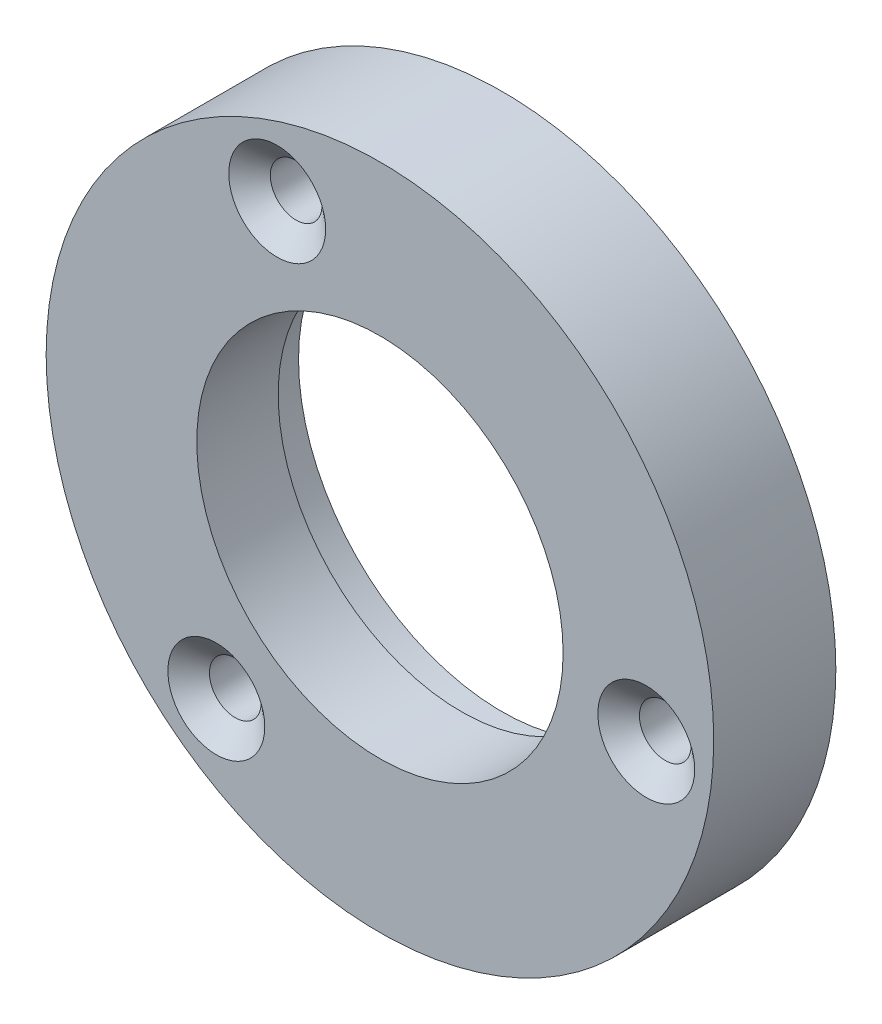
ISO-10303-21;
HEADER;
FILE_DESCRIPTION(('STEP AP214'),'2;1');
FILE_NAME('part.step','',(''),(''),'','','');
FILE_SCHEMA(('AUTOMOTIVE_DESIGN { 1 0 10303 214 1 1 1 1 }'));
ENDSEC;
DATA;
#1=APPLICATION_CONTEXT('core data for automotive mechanical design processes');
#2=APPLICATION_PROTOCOL_DEFINITION('international standard','automotive_design',2000,#1);
#3=PRODUCT_CONTEXT('',#1,'mechanical');
#4=PRODUCT('Part','Part','',(#3));
#5=PRODUCT_RELATED_PRODUCT_CATEGORY('part','',(#4));
#6=PRODUCT_DEFINITION_FORMATION('','',#4);
#7=PRODUCT_DEFINITION_CONTEXT('part definition',#1,'design');
#8=PRODUCT_DEFINITION('design','',#6,#7);
#9=PRODUCT_DEFINITION_SHAPE('','',#8);
#10=(LENGTH_UNIT() NAMED_UNIT(*) SI_UNIT(.MILLI.,.METRE.));
#11=(NAMED_UNIT(*) PLANE_ANGLE_UNIT() SI_UNIT($,.RADIAN.));
#12=(NAMED_UNIT(*) SI_UNIT($,.STERADIAN.) SOLID_ANGLE_UNIT());
#13=UNCERTAINTY_MEASURE_WITH_UNIT(LENGTH_MEASURE(1.E-05),#10,'distance_accuracy_value','');
#14=(GEOMETRIC_REPRESENTATION_CONTEXT(3) GLOBAL_UNCERTAINTY_ASSIGNED_CONTEXT((#13)) GLOBAL_UNIT_ASSIGNED_CONTEXT((#10,
#11,#12)) REPRESENTATION_CONTEXT('',''));
#15=CARTESIAN_POINT('',(0.,0.,0.));
#16=DIRECTION('',(0.,0.,1.));
#17=DIRECTION('',(1.,0.,0.));
#18=AXIS2_PLACEMENT_3D('',#15,#16,#17);
#19=CARTESIAN_POINT('',(0.,0.,0.));
#20=DIRECTION('',(0.,0.,1.));
#21=DIRECTION('',(1.,0.,0.));
#22=AXIS2_PLACEMENT_3D('',#19,#20,#21);
#23=CYLINDRICAL_SURFACE('',#22,5.715);
#24=CARTESIAN_POINT('',(0.,0.,3.81));
#25=DIRECTION('',(0.,0.,1.));
#26=DIRECTION('',(1.,0.,0.));
#27=AXIS2_PLACEMENT_3D('',#24,#25,#26);
#28=CIRCLE('',#27,5.715);
#29=CARTESIAN_POINT('',(5.715,0.,3.81));
#30=VERTEX_POINT('',#29);
#31=EDGE_CURVE('E51',#30,#30,#28,.T.);
#32=CARTESIAN_POINT('',(0.,0.,1.27));
#33=DIRECTION('',(0.,0.,-1.));
#34=DIRECTION('',(-1.,0.,0.));
#35=AXIS2_PLACEMENT_3D('',#32,#33,#34);
#36=CIRCLE('',#35,5.715);
#37=CARTESIAN_POINT('',(5.715,0.,1.27));
#38=VERTEX_POINT('',#37);
#39=EDGE_CURVE('E42',#38,#38,#36,.F.);
#40=CARTESIAN_POINT('',(5.715,0.,3.81));
#41=CARTESIAN_POINT('',(5.715,0.,3.78354166666667));
#42=CARTESIAN_POINT('',(5.715,0.,3.75708333333333));
#43=CARTESIAN_POINT('',(5.715,0.,3.70416666666667));
#44=CARTESIAN_POINT('',(5.715,0.,3.67770833333333));
#45=CARTESIAN_POINT('',(5.715,0.,3.62479166666667));
#46=CARTESIAN_POINT('',(5.715,0.,3.59833333333333));
#47=CARTESIAN_POINT('',(5.715,0.,3.54541666666667));
#48=CARTESIAN_POINT('',(5.715,0.,3.51895833333333));
#49=CARTESIAN_POINT('',(5.715,0.,3.46604166666667));
#50=CARTESIAN_POINT('',(5.715,0.,3.43958333333333));
#51=CARTESIAN_POINT('',(5.715,0.,3.38666666666667));
#52=CARTESIAN_POINT('',(5.715,0.,3.36020833333333));
#53=CARTESIAN_POINT('',(5.715,0.,3.30729166666667));
#54=CARTESIAN_POINT('',(5.715,0.,3.28083333333333));
#55=CARTESIAN_POINT('',(5.715,0.,3.22791666666667));
#56=CARTESIAN_POINT('',(5.715,0.,3.20145833333333));
#57=CARTESIAN_POINT('',(5.715,0.,3.14854166666667));
#58=CARTESIAN_POINT('',(5.715,0.,3.12208333333333));
#59=CARTESIAN_POINT('',(5.715,0.,3.06916666666667));
#60=CARTESIAN_POINT('',(5.715,0.,3.04270833333333));
#61=CARTESIAN_POINT('',(5.715,0.,2.98979166666667));
#62=CARTESIAN_POINT('',(5.715,0.,2.96333333333333));
#63=CARTESIAN_POINT('',(5.715,0.,2.91041666666667));
#64=CARTESIAN_POINT('',(5.715,0.,2.88395833333333));
#65=CARTESIAN_POINT('',(5.715,0.,2.83104166666667));
#66=CARTESIAN_POINT('',(5.715,0.,2.80458333333333));
#67=CARTESIAN_POINT('',(5.715,0.,2.75166666666667));
#68=CARTESIAN_POINT('',(5.715,0.,2.72520833333333));
#69=CARTESIAN_POINT('',(5.715,0.,2.67229166666667));
#70=CARTESIAN_POINT('',(5.715,0.,2.64583333333333));
#71=CARTESIAN_POINT('',(5.715,0.,2.59291666666667));
#72=CARTESIAN_POINT('',(5.715,0.,2.56645833333333));
#73=CARTESIAN_POINT('',(5.715,0.,2.51354166666667));
#74=CARTESIAN_POINT('',(5.715,0.,2.48708333333333));
#75=CARTESIAN_POINT('',(5.715,0.,2.43416666666667));
#76=CARTESIAN_POINT('',(5.715,0.,2.40770833333333));
#77=CARTESIAN_POINT('',(5.715,0.,2.35479166666667));
#78=CARTESIAN_POINT('',(5.715,0.,2.32833333333333));
#79=CARTESIAN_POINT('',(5.715,0.,2.27541666666667));
#80=CARTESIAN_POINT('',(5.715,0.,2.24895833333333));
#81=CARTESIAN_POINT('',(5.715,0.,2.19604166666667));
#82=CARTESIAN_POINT('',(5.715,0.,2.16958333333333));
#83=CARTESIAN_POINT('',(5.715,0.,2.11666666666667));
#84=CARTESIAN_POINT('',(5.715,0.,2.09020833333333));
#85=CARTESIAN_POINT('',(5.715,0.,2.03729166666667));
#86=CARTESIAN_POINT('',(5.715,0.,2.01083333333333));
#87=CARTESIAN_POINT('',(5.715,0.,1.95791666666667));
#88=CARTESIAN_POINT('',(5.715,0.,1.93145833333333));
#89=CARTESIAN_POINT('',(5.715,0.,1.87854166666667));
#90=CARTESIAN_POINT('',(5.715,0.,1.85208333333333));
#91=CARTESIAN_POINT('',(5.715,0.,1.79916666666667));
#92=CARTESIAN_POINT('',(5.715,0.,1.77270833333333));
#93=CARTESIAN_POINT('',(5.715,0.,1.71979166666667));
#94=CARTESIAN_POINT('',(5.715,0.,1.69333333333333));
#95=CARTESIAN_POINT('',(5.715,0.,1.64041666666667));
#96=CARTESIAN_POINT('',(5.715,0.,1.61395833333333));
#97=CARTESIAN_POINT('',(5.715,0.,1.56104166666667));
#98=CARTESIAN_POINT('',(5.715,0.,1.53458333333333));
#99=CARTESIAN_POINT('',(5.715,0.,1.48166666666667));
#100=CARTESIAN_POINT('',(5.715,0.,1.45520833333333));
#101=CARTESIAN_POINT('',(5.715,0.,1.40229166666667));
#102=CARTESIAN_POINT('',(5.715,0.,1.37583333333333));
#103=CARTESIAN_POINT('',(5.715,0.,1.32291666666667));
#104=CARTESIAN_POINT('',(5.715,0.,1.29645833333333));
#105=CARTESIAN_POINT('',(5.715,0.,1.27));
#106=B_SPLINE_CURVE_WITH_KNOTS('',3,(#40,#41,#42,#43,#44,#45,#46,#47,#48,#49,#50,#51,#52,#53,
#54,#55,#56,#57,#58,#59,#60,#61,#62,#63,#64,#65,#66,#67,#68,#69,#70,#71,#72,#73,#74,#75,#76,#77,
#78,#79,#80,#81,#82,#83,#84,#85,#86,#87,#88,#89,#90,#91,#92,#93,#94,#95,#96,#97,#98,#99,#100,
#101,#102,#103,#104,#105),.UNSPECIFIED.,.F.,.F.,(4,2,2,2,2,2,2,2,2,2,2,2,2,2,2,2,2,2,2,2,2,2,2,
2,2,2,2,2,2,2,2,2,4),(0.,0.079375,0.15875,0.238125,0.3175,0.396875,0.47625,0.555625,0.635,
0.714375,0.79375,0.873125,0.9525,1.031875,1.11125,1.190625,1.27,1.349375,1.42875,1.508125,
1.5875,1.666875,1.74625,1.825625,1.905,1.984375,2.06375,2.143125,2.2225,2.301875,2.38125,
2.460625,2.54),.UNSPECIFIED.);
#107=EDGE_CURVE('BSEAM38',#30,#38,#106,.T.);
#108=ORIENTED_EDGE('',*,*,#31,.T.);
#109=ORIENTED_EDGE('',*,*,#39,.F.);
#110=ORIENTED_EDGE('',*,*,#107,.T.);
#111=ORIENTED_EDGE('',*,*,#107,.F.);
#112=EDGE_LOOP('',(#108,#110,#109,#111));
#113=FACE_BOUND('',#112,.T.);
#114=ADVANCED_FACE('F38',(#113),#23,.F.);
#115=CARTESIAN_POINT('',(0.,0.,3.81));
#116=DIRECTION('',(0.,0.,-1.));
#117=DIRECTION('',(-1.,0.,0.));
#118=AXIS2_PLACEMENT_3D('',#115,#116,#117);
#119=CYLINDRICAL_SURFACE('',#118,10.414);
#120=CARTESIAN_POINT('',(0.,0.,3.81));
#121=DIRECTION('',(0.,0.,1.));
#122=DIRECTION('',(1.,0.,0.));
#123=AXIS2_PLACEMENT_3D('',#120,#121,#122);
#124=CIRCLE('',#123,10.414);
#125=CARTESIAN_POINT('',(-10.414,0.,3.81));
#126=VERTEX_POINT('',#125);
#127=EDGE_CURVE('E10',#126,#126,#124,.T.);
#128=CARTESIAN_POINT('',(0.,0.,0.));
#129=DIRECTION('',(0.,0.,1.));
#130=DIRECTION('',(1.,0.,0.));
#131=AXIS2_PLACEMENT_3D('',#128,#129,#130);
#132=CIRCLE('',#131,10.414);
#133=CARTESIAN_POINT('',(-10.414,0.,0.));
#134=VERTEX_POINT('',#133);
#135=EDGE_CURVE('E46',#134,#134,#132,.T.);
#136=CARTESIAN_POINT('',(-10.414,0.,3.81));
#137=CARTESIAN_POINT('',(-10.414,0.,3.7703125));
#138=CARTESIAN_POINT('',(-10.414,0.,3.730625));
#139=CARTESIAN_POINT('',(-10.414,0.,3.65125));
#140=CARTESIAN_POINT('',(-10.414,0.,3.6115625));
#141=CARTESIAN_POINT('',(-10.414,0.,3.5321875));
#142=CARTESIAN_POINT('',(-10.414,0.,3.4925));
#143=CARTESIAN_POINT('',(-10.414,0.,3.413125));
#144=CARTESIAN_POINT('',(-10.414,0.,3.3734375));
#145=CARTESIAN_POINT('',(-10.414,0.,3.2940625));
#146=CARTESIAN_POINT('',(-10.414,0.,3.254375));
#147=CARTESIAN_POINT('',(-10.414,0.,3.175));
#148=CARTESIAN_POINT('',(-10.414,0.,3.1353125));
#149=CARTESIAN_POINT('',(-10.414,0.,3.0559375));
#150=CARTESIAN_POINT('',(-10.414,0.,3.01625));
#151=CARTESIAN_POINT('',(-10.414,0.,2.936875));
#152=CARTESIAN_POINT('',(-10.414,0.,2.8971875));
#153=CARTESIAN_POINT('',(-10.414,0.,2.8178125));
#154=CARTESIAN_POINT('',(-10.414,0.,2.778125));
#155=CARTESIAN_POINT('',(-10.414,0.,2.69875));
#156=CARTESIAN_POINT('',(-10.414,0.,2.6590625));
#157=CARTESIAN_POINT('',(-10.414,0.,2.5796875));
#158=CARTESIAN_POINT('',(-10.414,0.,2.54));
#159=CARTESIAN_POINT('',(-10.414,0.,2.460625));
#160=CARTESIAN_POINT('',(-10.414,0.,2.4209375));
#161=CARTESIAN_POINT('',(-10.414,0.,2.3415625));
#162=CARTESIAN_POINT('',(-10.414,0.,2.301875));
#163=CARTESIAN_POINT('',(-10.414,0.,2.2225));
#164=CARTESIAN_POINT('',(-10.414,0.,2.1828125));
#165=CARTESIAN_POINT('',(-10.414,0.,2.1034375));
#166=CARTESIAN_POINT('',(-10.414,0.,2.06375));
#167=CARTESIAN_POINT('',(-10.414,0.,1.984375));
#168=CARTESIAN_POINT('',(-10.414,0.,1.9446875));
#169=CARTESIAN_POINT('',(-10.414,0.,1.8653125));
#170=CARTESIAN_POINT('',(-10.414,0.,1.825625));
#171=CARTESIAN_POINT('',(-10.414,0.,1.74625));
#172=CARTESIAN_POINT('',(-10.414,0.,1.7065625));
#173=CARTESIAN_POINT('',(-10.414,0.,1.6271875));
#174=CARTESIAN_POINT('',(-10.414,0.,1.5875));
#175=CARTESIAN_POINT('',(-10.414,0.,1.508125));
#176=CARTESIAN_POINT('',(-10.414,0.,1.4684375));
#177=CARTESIAN_POINT('',(-10.414,0.,1.3890625));
#178=CARTESIAN_POINT('',(-10.414,0.,1.349375));
#179=CARTESIAN_POINT('',(-10.414,0.,1.27));
#180=CARTESIAN_POINT('',(-10.414,0.,1.2303125));
#181=CARTESIAN_POINT('',(-10.414,0.,1.1509375));
#182=CARTESIAN_POINT('',(-10.414,0.,1.11125));
#183=CARTESIAN_POINT('',(-10.414,0.,1.031875));
#184=CARTESIAN_POINT('',(-10.414,0.,0.9921875));
#185=CARTESIAN_POINT('',(-10.414,0.,0.9128125));
#186=CARTESIAN_POINT('',(-10.414,0.,0.873125));
#187=CARTESIAN_POINT('',(-10.414,0.,0.79375));
#188=CARTESIAN_POINT('',(-10.414,0.,0.7540625));
#189=CARTESIAN_POINT('',(-10.414,0.,0.6746875));
#190=CARTESIAN_POINT('',(-10.414,0.,0.635));
#191=CARTESIAN_POINT('',(-10.414,0.,0.555625));
#192=CARTESIAN_POINT('',(-10.414,0.,0.5159375));
#193=CARTESIAN_POINT('',(-10.414,0.,0.4365625));
#194=CARTESIAN_POINT('',(-10.414,0.,0.396875));
#195=CARTESIAN_POINT('',(-10.414,0.,0.3175));
#196=CARTESIAN_POINT('',(-10.414,0.,0.2778125));
#197=CARTESIAN_POINT('',(-10.414,0.,0.1984375));
#198=CARTESIAN_POINT('',(-10.414,0.,0.15875));
#199=CARTESIAN_POINT('',(-10.414,0.,0.0793749999999999));
#200=CARTESIAN_POINT('',(-10.414,0.,0.0396874999999999));
#201=CARTESIAN_POINT('',(-10.414,0.,0.));
#202=B_SPLINE_CURVE_WITH_KNOTS('',3,(#136,#137,#138,#139,#140,#141,#142,#143,#144,#145,#146,
#147,#148,#149,#150,#151,#152,#153,#154,#155,#156,#157,#158,#159,#160,#161,#162,#163,#164,#165,
#166,#167,#168,#169,#170,#171,#172,#173,#174,#175,#176,#177,#178,#179,#180,#181,#182,#183,#184,
#185,#186,#187,#188,#189,#190,#191,#192,#193,#194,#195,#196,#197,#198,#199,#200,#201),
.UNSPECIFIED.,.F.,.F.,(4,2,2,2,2,2,2,2,2,2,2,2,2,2,2,2,2,2,2,2,2,2,2,2,2,2,2,2,2,2,2,2,4),(0.,
0.1190625,0.238125,0.3571875,0.47625,0.5953125,0.714375,0.8334375,0.9525,1.0715625,1.190625,
1.3096875,1.42875,1.5478125,1.666875,1.7859375,1.905,2.0240625,2.143125,2.2621875,2.38125,
2.5003125,2.619375,2.7384375,2.8575,2.9765625,3.095625,3.2146875,3.33375,3.4528125,3.571875,
3.6909375,3.81),.UNSPECIFIED.);
#203=EDGE_CURVE('BSEAM40',#126,#134,#202,.T.);
#204=ORIENTED_EDGE('',*,*,#127,.F.);
#205=ORIENTED_EDGE('',*,*,#135,.T.);
#206=ORIENTED_EDGE('',*,*,#203,.T.);
#207=ORIENTED_EDGE('',*,*,#203,.F.);
#208=EDGE_LOOP('',(#204,#206,#205,#207));
#209=FACE_BOUND('',#208,.T.);
#210=ADVANCED_FACE('F40',(#209),#119,.T.);
#211=CARTESIAN_POINT('',(0.,0.,3.81));
#212=DIRECTION('',(0.,0.,1.));
#213=DIRECTION('',(1.,0.,0.));
#214=AXIS2_PLACEMENT_3D('',#211,#212,#213);
#215=PLANE('',#214);
#216=CARTESIAN_POINT('',(-3.20531600675955,7.74492564824292,3.81));
#217=DIRECTION('',(0.,0.,1.));
#218=DIRECTION('',(1.,0.,0.));
#219=AXIS2_PLACEMENT_3D('',#216,#217,#218);
#220=CIRCLE('',#219,1.5113);
#221=CARTESIAN_POINT('',(-1.69401600675955,7.74492564824292,3.81));
#222=VERTEX_POINT('',#221);
#223=EDGE_CURVE('E85',#222,#222,#220,.T.);
#224=ORIENTED_EDGE('',*,*,#223,.F.);
#225=EDGE_LOOP('',(#224));
#226=FACE_BOUND('',#225,.T.);
#227=CARTESIAN_POINT('',(8.3099603651798,-1.09657773511083,3.81));
#228=DIRECTION('',(0.,0.,1.));
#229=DIRECTION('',(1.,0.,0.));
#230=AXIS2_PLACEMENT_3D('',#227,#228,#229);
#231=CIRCLE('',#230,1.5113);
#232=CARTESIAN_POINT('',(9.82126036517981,-1.09657773511083,3.81));
#233=VERTEX_POINT('',#232);
#234=EDGE_CURVE('E76',#233,#233,#231,.T.);
#235=ORIENTED_EDGE('',*,*,#234,.F.);
#236=EDGE_LOOP('',(#235));
#237=FACE_BOUND('',#236,.T.);
#238=CARTESIAN_POINT('',(-5.10464435842031,-6.64834791313208,3.81));
#239=DIRECTION('',(0.,0.,1.));
#240=DIRECTION('',(1.,0.,0.));
#241=AXIS2_PLACEMENT_3D('',#238,#239,#240);
#242=CIRCLE('',#241,1.5113);
#243=CARTESIAN_POINT('',(-3.59334435842031,-6.64834791313208,3.81));
#244=VERTEX_POINT('',#243);
#245=EDGE_CURVE('E67',#244,#244,#242,.T.);
#246=ORIENTED_EDGE('',*,*,#245,.F.);
#247=EDGE_LOOP('',(#246));
#248=FACE_BOUND('',#247,.T.);
#249=ORIENTED_EDGE('',*,*,#31,.F.);
#250=EDGE_LOOP('',(#249));
#251=FACE_BOUND('',#250,.T.);
#252=ORIENTED_EDGE('',*,*,#127,.T.);
#253=EDGE_LOOP('',(#252));
#254=FACE_BOUND('',#253,.T.);
#255=ADVANCED_FACE('F91',(#226,#237,#248,#251,#254),#215,.T.);
#256=CARTESIAN_POINT('',(0.,0.,0.));
#257=DIRECTION('',(0.,0.,1.));
#258=DIRECTION('',(1.,0.,0.));
#259=AXIS2_PLACEMENT_3D('',#256,#257,#258);
#260=PLANE('',#259);
#261=CARTESIAN_POINT('',(-3.20531600675955,7.74492564824292,0.));
#262=DIRECTION('',(0.,0.,1.));
#263=DIRECTION('',(1.,0.,0.));
#264=AXIS2_PLACEMENT_3D('',#261,#262,#263);
#265=CIRCLE('',#264,0.806449999999998);
#266=CARTESIAN_POINT('',(-2.39886600675956,7.74492564824292,0.));
#267=VERTEX_POINT('',#266);
#268=EDGE_CURVE('E79',#267,#267,#265,.T.);
#269=ORIENTED_EDGE('',*,*,#268,.T.);
#270=EDGE_LOOP('',(#269));
#271=FACE_BOUND('',#270,.T.);
#272=CARTESIAN_POINT('',(8.3099603651798,-1.09657773511083,0.));
#273=DIRECTION('',(0.,0.,1.));
#274=DIRECTION('',(1.,0.,0.));
#275=AXIS2_PLACEMENT_3D('',#272,#273,#274);
#276=CIRCLE('',#275,0.806449999999998);
#277=CARTESIAN_POINT('',(9.1164103651798,-1.09657773511083,0.));
#278=VERTEX_POINT('',#277);
#279=EDGE_CURVE('E70',#278,#278,#276,.T.);
#280=ORIENTED_EDGE('',*,*,#279,.T.);
#281=EDGE_LOOP('',(#280));
#282=FACE_BOUND('',#281,.T.);
#283=CARTESIAN_POINT('',(-5.10464435842031,-6.64834791313208,0.));
#284=DIRECTION('',(0.,0.,1.));
#285=DIRECTION('',(1.,0.,0.));
#286=AXIS2_PLACEMENT_3D('',#283,#284,#285);
#287=CIRCLE('',#286,0.806449999999998);
#288=CARTESIAN_POINT('',(-4.29819435842032,-6.64834791313208,0.));
#289=VERTEX_POINT('',#288);
#290=EDGE_CURVE('E59',#289,#289,#287,.T.);
#291=ORIENTED_EDGE('',*,*,#290,.T.);
#292=EDGE_LOOP('',(#291));
#293=FACE_BOUND('',#292,.T.);
#294=CARTESIAN_POINT('',(0.,0.,0.));
#295=DIRECTION('',(0.,0.,-1.));
#296=DIRECTION('',(-1.,0.,0.));
#297=AXIS2_PLACEMENT_3D('',#294,#295,#296);
#298=CIRCLE('',#297,6.35);
#299=CARTESIAN_POINT('',(-6.35,0.,0.));
#300=VERTEX_POINT('',#299);
#301=EDGE_CURVE('E55',#300,#300,#298,.T.);
#302=ORIENTED_EDGE('',*,*,#301,.F.);
#303=EDGE_LOOP('',(#302));
#304=FACE_BOUND('',#303,.T.);
#305=ORIENTED_EDGE('',*,*,#135,.F.);
#306=EDGE_LOOP('',(#305));
#307=FACE_BOUND('',#306,.T.);
#308=ADVANCED_FACE('F94',(#271,#282,#293,#304,#307),#260,.F.);
#309=CARTESIAN_POINT('',(0.,0.,1.27));
#310=DIRECTION('',(0.,0.,-1.));
#311=DIRECTION('',(-1.,0.,0.));
#312=AXIS2_PLACEMENT_3D('',#309,#310,#311);
#313=PLANE('',#312);
#314=CARTESIAN_POINT('',(0.,0.,1.27));
#315=DIRECTION('',(0.,0.,-1.));
#316=DIRECTION('',(-1.,0.,0.));
#317=AXIS2_PLACEMENT_3D('',#314,#315,#316);
#318=CIRCLE('',#317,6.35);
#319=CARTESIAN_POINT('',(-6.35,0.,1.27));
#320=VERTEX_POINT('',#319);
#321=EDGE_CURVE('E58',#320,#320,#318,.T.);
#322=ORIENTED_EDGE('',*,*,#321,.T.);
#323=EDGE_LOOP('',(#322));
#324=FACE_BOUND('',#323,.T.);
#325=ORIENTED_EDGE('',*,*,#39,.T.);
#326=EDGE_LOOP('',(#325));
#327=FACE_BOUND('',#326,.T.);
#328=ADVANCED_FACE('F108',(#324,#327),#313,.T.);
#329=CARTESIAN_POINT('',(0.,0.,1.27));
#330=DIRECTION('',(0.,0.,-1.));
#331=DIRECTION('',(-1.,0.,0.));
#332=AXIS2_PLACEMENT_3D('',#329,#330,#331);
#333=CYLINDRICAL_SURFACE('',#332,6.35);
#334=ORIENTED_EDGE('',*,*,#321,.F.);
#335=EDGE_LOOP('',(#334));
#336=FACE_BOUND('',#335,.T.);
#337=ORIENTED_EDGE('',*,*,#301,.T.);
#338=EDGE_LOOP('',(#337));
#339=FACE_BOUND('',#338,.T.);
#340=ADVANCED_FACE('F110',(#336,#339),#333,.F.);
#341=CARTESIAN_POINT('',(-5.10464435842031,-6.64834791313208,3.81));
#342=DIRECTION('',(0.,0.,1.));
#343=DIRECTION('',(1.,0.,0.));
#344=AXIS2_PLACEMENT_3D('',#341,#342,#343);
#345=CYLINDRICAL_SURFACE('',#344,0.806449999999998);
#346=ORIENTED_EDGE('',*,*,#290,.F.);
#347=EDGE_LOOP('',(#346));
#348=FACE_BOUND('',#347,.T.);
#349=CARTESIAN_POINT('',(-5.10464435842031,-6.64834791313208,3.21856062496469));
#350=DIRECTION('',(0.,0.,1.));
#351=DIRECTION('',(1.,0.,0.));
#352=AXIS2_PLACEMENT_3D('',#349,#350,#351);
#353=CIRCLE('',#352,0.806449999999998);
#354=CARTESIAN_POINT('',(-4.29819435842032,-6.64834791313208,3.21856062496469));
#355=VERTEX_POINT('',#354);
#356=EDGE_CURVE('E64',#355,#355,#353,.T.);
#357=ORIENTED_EDGE('',*,*,#356,.T.);
#358=EDGE_LOOP('',(#357));
#359=FACE_BOUND('',#358,.T.);
#360=ADVANCED_FACE('F117',(#348,#359),#345,.F.);
#361=CARTESIAN_POINT('',(-5.10464435842031,-6.64834791313208,3.81));
#362=DIRECTION('',(0.,0.,1.));
#363=DIRECTION('',(1.,0.,0.));
#364=AXIS2_PLACEMENT_3D('',#361,#362,#363);
#365=CONICAL_SURFACE('',#364,1.5113,0.872664625997166);
#366=ORIENTED_EDGE('',*,*,#356,.F.);
#367=EDGE_LOOP('',(#366));
#368=FACE_BOUND('',#367,.T.);
#369=ORIENTED_EDGE('',*,*,#245,.T.);
#370=EDGE_LOOP('',(#369));
#371=FACE_BOUND('',#370,.T.);
#372=ADVANCED_FACE('F124',(#368,#371),#365,.F.);
#373=CARTESIAN_POINT('',(8.3099603651798,-1.09657773511083,3.81));
#374=DIRECTION('',(0.,0.,1.));
#375=DIRECTION('',(1.,0.,0.));
#376=AXIS2_PLACEMENT_3D('',#373,#374,#375);
#377=CYLINDRICAL_SURFACE('',#376,0.806449999999998);
#378=ORIENTED_EDGE('',*,*,#279,.F.);
#379=EDGE_LOOP('',(#378));
#380=FACE_BOUND('',#379,.T.);
#381=CARTESIAN_POINT('',(8.3099603651798,-1.09657773511083,3.21856062496469));
#382=DIRECTION('',(0.,0.,1.));
#383=DIRECTION('',(1.,0.,0.));
#384=AXIS2_PLACEMENT_3D('',#381,#382,#383);
#385=CIRCLE('',#384,0.806449999999998);
#386=CARTESIAN_POINT('',(9.1164103651798,-1.09657773511083,3.21856062496469));
#387=VERTEX_POINT('',#386);
#388=EDGE_CURVE('E73',#387,#387,#385,.T.);
#389=ORIENTED_EDGE('',*,*,#388,.T.);
#390=EDGE_LOOP('',(#389));
#391=FACE_BOUND('',#390,.T.);
#392=ADVANCED_FACE('F128',(#380,#391),#377,.F.);
#393=CARTESIAN_POINT('',(8.3099603651798,-1.09657773511083,3.81));
#394=DIRECTION('',(0.,0.,1.));
#395=DIRECTION('',(1.,0.,0.));
#396=AXIS2_PLACEMENT_3D('',#393,#394,#395);
#397=CONICAL_SURFACE('',#396,1.5113,0.872664625997166);
#398=ORIENTED_EDGE('',*,*,#388,.F.);
#399=EDGE_LOOP('',(#398));
#400=FACE_BOUND('',#399,.T.);
#401=ORIENTED_EDGE('',*,*,#234,.T.);
#402=EDGE_LOOP('',(#401));
#403=FACE_BOUND('',#402,.T.);
#404=ADVANCED_FACE('F132',(#400,#403),#397,.F.);
#405=CARTESIAN_POINT('',(-3.20531600675955,7.74492564824292,3.81));
#406=DIRECTION('',(0.,0.,1.));
#407=DIRECTION('',(1.,0.,0.));
#408=AXIS2_PLACEMENT_3D('',#405,#406,#407);
#409=CYLINDRICAL_SURFACE('',#408,0.806449999999998);
#410=ORIENTED_EDGE('',*,*,#268,.F.);
#411=EDGE_LOOP('',(#410));
#412=FACE_BOUND('',#411,.T.);
#413=CARTESIAN_POINT('',(-3.20531600675955,7.74492564824292,3.21856062496469));
#414=DIRECTION('',(0.,0.,1.));
#415=DIRECTION('',(1.,0.,0.));
#416=AXIS2_PLACEMENT_3D('',#413,#414,#415);
#417=CIRCLE('',#416,0.806449999999998);
#418=CARTESIAN_POINT('',(-2.39886600675956,7.74492564824292,3.21856062496469));
#419=VERTEX_POINT('',#418);
#420=EDGE_CURVE('E82',#419,#419,#417,.T.);
#421=ORIENTED_EDGE('',*,*,#420,.T.);
#422=EDGE_LOOP('',(#421));
#423=FACE_BOUND('',#422,.T.);
#424=ADVANCED_FACE('F136',(#412,#423),#409,.F.);
#425=CARTESIAN_POINT('',(-3.20531600675955,7.74492564824292,3.81));
#426=DIRECTION('',(0.,0.,1.));
#427=DIRECTION('',(1.,0.,0.));
#428=AXIS2_PLACEMENT_3D('',#425,#426,#427);
#429=CONICAL_SURFACE('',#428,1.5113,0.872664625997166);
#430=ORIENTED_EDGE('',*,*,#420,.F.);
#431=EDGE_LOOP('',(#430));
#432=FACE_BOUND('',#431,.T.);
#433=ORIENTED_EDGE('',*,*,#223,.T.);
#434=EDGE_LOOP('',(#433));
#435=FACE_BOUND('',#434,.T.);
#436=ADVANCED_FACE('F89',(#432,#435),#429,.F.);
#437=CLOSED_SHELL('',(#114,#210,#255,#308,#328,#340,#360,#372,#392,#404,#424,#436));
#438=MANIFOLD_SOLID_BREP('B2',#437);
#439=ADVANCED_BREP_SHAPE_REPRESENTATION('',(#18,#438),#14);
#440=SHAPE_DEFINITION_REPRESENTATION(#9,#439);
ENDSEC;
END-ISO-10303-21;
